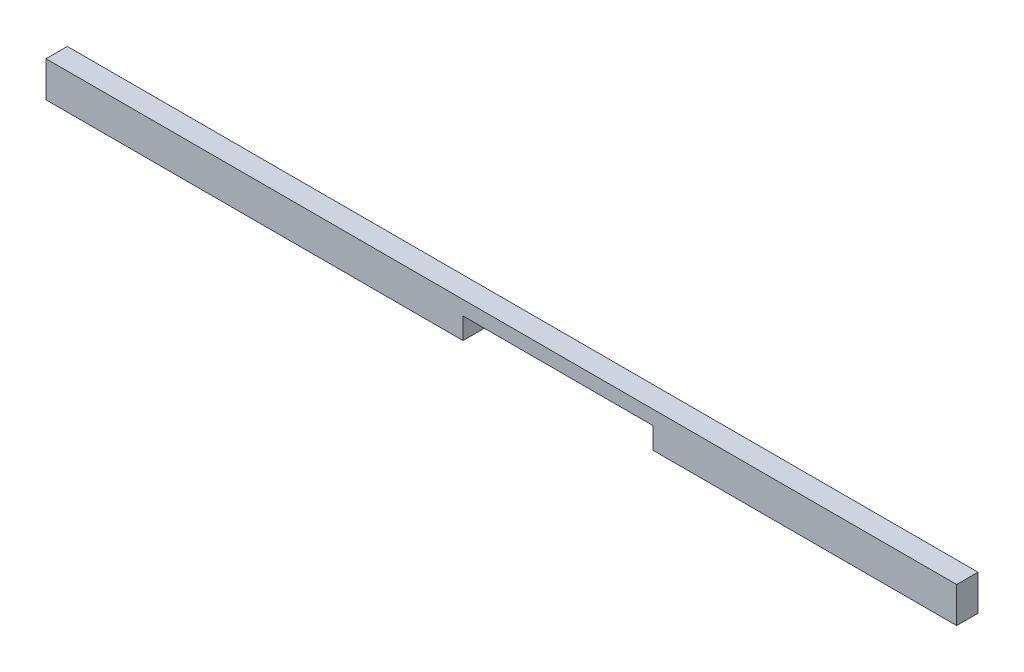
ISO-10303-21;
HEADER;
FILE_DESCRIPTION(('STEP AP214'),'2;1');
FILE_NAME('part.step','',(''),(''),'','','');
FILE_SCHEMA(('AUTOMOTIVE_DESIGN { 1 0 10303 214 1 1 1 1 }'));
ENDSEC;
DATA;
#1=APPLICATION_CONTEXT('core data for automotive mechanical design processes');
#2=APPLICATION_PROTOCOL_DEFINITION('international standard','automotive_design',2000,#1);
#3=PRODUCT_CONTEXT('',#1,'mechanical');
#4=PRODUCT('Part','Part','',(#3));
#5=PRODUCT_RELATED_PRODUCT_CATEGORY('part','',(#4));
#6=PRODUCT_DEFINITION_FORMATION('','',#4);
#7=PRODUCT_DEFINITION_CONTEXT('part definition',#1,'design');
#8=PRODUCT_DEFINITION('design','',#6,#7);
#9=PRODUCT_DEFINITION_SHAPE('','',#8);
#10=(LENGTH_UNIT() NAMED_UNIT(*) SI_UNIT(.MILLI.,.METRE.));
#11=(NAMED_UNIT(*) PLANE_ANGLE_UNIT() SI_UNIT($,.RADIAN.));
#12=(NAMED_UNIT(*) SI_UNIT($,.STERADIAN.) SOLID_ANGLE_UNIT());
#13=UNCERTAINTY_MEASURE_WITH_UNIT(LENGTH_MEASURE(1.E-05),#10,'distance_accuracy_value','');
#14=(GEOMETRIC_REPRESENTATION_CONTEXT(3) GLOBAL_UNCERTAINTY_ASSIGNED_CONTEXT((#13)) GLOBAL_UNIT_ASSIGNED_CONTEXT((#10,
#11,#12)) REPRESENTATION_CONTEXT('',''));
#15=CARTESIAN_POINT('',(0.,0.,0.));
#16=DIRECTION('',(0.,0.,1.));
#17=DIRECTION('',(1.,0.,0.));
#18=AXIS2_PLACEMENT_3D('',#15,#16,#17);
#19=CARTESIAN_POINT('',(0.,0.,0.));
#20=DIRECTION('',(0.,-1.,0.));
#21=DIRECTION('',(0.,0.,-1.));
#22=AXIS2_PLACEMENT_3D('',#19,#20,#21);
#23=PLANE('',#22);
#24=DIRECTION('',(0.,0.,-1.));
#25=VECTOR('',#24,1.);
#26=CARTESIAN_POINT('',(-34.1824934363978,0.,9.525));
#27=LINE('',#26,#25);
#28=CARTESIAN_POINT('',(-34.1824934363978,0.,9.525));
#29=VERTEX_POINT('',#28);
#30=CARTESIAN_POINT('',(-34.1824934363978,0.,-9.525));
#31=VERTEX_POINT('',#30);
#32=EDGE_CURVE('E139',#29,#31,#27,.T.);
#33=ORIENTED_EDGE('',*,*,#32,.F.);
#34=DIRECTION('',(1.,0.,0.));
#35=VECTOR('',#34,1.);
#36=CARTESIAN_POINT('',(-406.4,0.,9.525));
#37=LINE('',#36,#35);
#38=CARTESIAN_POINT('',(-406.4,0.,9.525));
#39=VERTEX_POINT('',#38);
#40=EDGE_CURVE('E131',#39,#29,#37,.T.);
#41=ORIENTED_EDGE('',*,*,#40,.F.);
#42=DIRECTION('',(0.,0.,1.));
#43=VECTOR('',#42,1.);
#44=CARTESIAN_POINT('',(-406.4,0.,9.525));
#45=LINE('',#44,#43);
#46=CARTESIAN_POINT('',(-406.4,0.,-9.525));
#47=VERTEX_POINT('',#46);
#48=EDGE_CURVE('E158',#47,#39,#45,.T.);
#49=ORIENTED_EDGE('',*,*,#48,.F.);
#50=DIRECTION('',(-1.,0.,0.));
#51=VECTOR('',#50,1.);
#52=CARTESIAN_POINT('',(-406.4,0.,-9.525));
#53=LINE('',#52,#51);
#54=EDGE_CURVE('E154',#31,#47,#53,.T.);
#55=ORIENTED_EDGE('',*,*,#54,.F.);
#56=EDGE_LOOP('',(#33,#41,#49,#55));
#57=FACE_BOUND('',#56,.T.);
#58=ADVANCED_FACE('F35',(#57),#23,.T.);
#59=CARTESIAN_POINT('',(406.4,31.75,9.525));
#60=DIRECTION('',(-1.,0.,0.));
#61=DIRECTION('',(0.,0.,1.));
#62=AXIS2_PLACEMENT_3D('',#59,#60,#61);
#63=PLANE('',#62);
#64=DIRECTION('',(0.,0.,-1.));
#65=VECTOR('',#64,1.);
#66=CARTESIAN_POINT('',(406.4,0.,9.525));
#67=LINE('',#66,#65);
#68=CARTESIAN_POINT('',(406.4,0.,9.525));
#69=VERTEX_POINT('',#68);
#70=CARTESIAN_POINT('',(406.4,0.,-9.525));
#71=VERTEX_POINT('',#70);
#72=EDGE_CURVE('E141',#69,#71,#67,.T.);
#73=ORIENTED_EDGE('',*,*,#72,.T.);
#74=DIRECTION('',(0.,-1.,0.));
#75=VECTOR('',#74,1.);
#76=CARTESIAN_POINT('',(406.4,31.75,-9.525));
#77=LINE('',#76,#75);
#78=CARTESIAN_POINT('',(406.4,31.75,-9.525));
#79=VERTEX_POINT('',#78);
#80=EDGE_CURVE('E11',#79,#71,#77,.T.);
#81=ORIENTED_EDGE('',*,*,#80,.F.);
#82=DIRECTION('',(0.,0.,-1.));
#83=VECTOR('',#82,1.);
#84=CARTESIAN_POINT('',(406.4,31.75,9.525));
#85=LINE('',#84,#83);
#86=CARTESIAN_POINT('',(406.4,31.75,9.525));
#87=VERTEX_POINT('',#86);
#88=EDGE_CURVE('E145',#87,#79,#85,.T.);
#89=ORIENTED_EDGE('',*,*,#88,.F.);
#90=DIRECTION('',(0.,-1.,0.));
#91=VECTOR('',#90,1.);
#92=CARTESIAN_POINT('',(406.4,31.75,9.525));
#93=LINE('',#92,#91);
#94=EDGE_CURVE('E151',#87,#69,#93,.T.);
#95=ORIENTED_EDGE('',*,*,#94,.T.);
#96=EDGE_LOOP('',(#73,#81,#89,#95));
#97=FACE_BOUND('',#96,.T.);
#98=ADVANCED_FACE('F37',(#97),#63,.F.);
#99=CARTESIAN_POINT('',(-406.4,31.75,-9.525));
#100=DIRECTION('',(0.,0.,1.));
#101=DIRECTION('',(1.,0.,0.));
#102=AXIS2_PLACEMENT_3D('',#99,#100,#101);
#103=PLANE('',#102);
#104=DIRECTION('',(1.,0.,0.));
#105=VECTOR('',#104,1.);
#106=CARTESIAN_POINT('',(-34.1824934363978,19.05,-9.525));
#107=LINE('',#106,#105);
#108=CARTESIAN_POINT('',(-34.1824934363978,19.05,-9.525));
#109=VERTEX_POINT('',#108);
#110=CARTESIAN_POINT('',(135.206139415608,19.05,-9.525));
#111=VERTEX_POINT('',#110);
#112=EDGE_CURVE('E133',#109,#111,#107,.T.);
#113=ORIENTED_EDGE('',*,*,#112,.F.);
#114=DIRECTION('',(0.,1.,0.));
#115=VECTOR('',#114,1.);
#116=CARTESIAN_POINT('',(-34.1824934363978,0.,-9.525));
#117=LINE('',#116,#115);
#118=EDGE_CURVE('E115',#31,#109,#117,.T.);
#119=ORIENTED_EDGE('',*,*,#118,.F.);
#120=ORIENTED_EDGE('',*,*,#54,.T.);
#121=DIRECTION('',(0.,-1.,0.));
#122=VECTOR('',#121,1.);
#123=CARTESIAN_POINT('',(-406.4,31.75,-9.525));
#124=LINE('',#123,#122);
#125=CARTESIAN_POINT('',(-406.4,31.75,-9.525));
#126=VERTEX_POINT('',#125);
#127=EDGE_CURVE('E43',#126,#47,#124,.T.);
#128=ORIENTED_EDGE('',*,*,#127,.F.);
#129=DIRECTION('',(-1.,0.,0.));
#130=VECTOR('',#129,1.);
#131=CARTESIAN_POINT('',(-406.4,31.75,-9.525));
#132=LINE('',#131,#130);
#133=EDGE_CURVE('E87',#79,#126,#132,.T.);
#134=ORIENTED_EDGE('',*,*,#133,.F.);
#135=ORIENTED_EDGE('',*,*,#80,.T.);
#136=CARTESIAN_POINT('',(135.206139415608,0.,-9.525));
#137=VERTEX_POINT('',#136);
#138=EDGE_CURVE('E155',#71,#137,#53,.T.);
#139=ORIENTED_EDGE('',*,*,#138,.T.);
#140=DIRECTION('',(0.,-1.,0.));
#141=VECTOR('',#140,1.);
#142=CARTESIAN_POINT('',(135.206139415608,19.05,-9.525));
#143=LINE('',#142,#141);
#144=EDGE_CURVE('E50',#111,#137,#143,.T.);
#145=ORIENTED_EDGE('',*,*,#144,.F.);
#146=EDGE_LOOP('',(#113,#119,#120,#128,#134,#135,#139,#145));
#147=FACE_BOUND('',#146,.T.);
#148=ADVANCED_FACE('F171',(#147),#103,.F.);
#149=CARTESIAN_POINT('',(-406.4,31.75,9.525));
#150=DIRECTION('',(1.,0.,0.));
#151=DIRECTION('',(0.,0.,-1.));
#152=AXIS2_PLACEMENT_3D('',#149,#150,#151);
#153=PLANE('',#152);
#154=ORIENTED_EDGE('',*,*,#48,.T.);
#155=DIRECTION('',(0.,-1.,0.));
#156=VECTOR('',#155,1.);
#157=CARTESIAN_POINT('',(-406.4,31.75,9.525));
#158=LINE('',#157,#156);
#159=CARTESIAN_POINT('',(-406.4,31.75,9.525));
#160=VERTEX_POINT('',#159);
#161=EDGE_CURVE('E162',#160,#39,#158,.T.);
#162=ORIENTED_EDGE('',*,*,#161,.F.);
#163=DIRECTION('',(0.,0.,1.));
#164=VECTOR('',#163,1.);
#165=CARTESIAN_POINT('',(-406.4,31.75,9.525));
#166=LINE('',#165,#164);
#167=EDGE_CURVE('E148',#126,#160,#166,.T.);
#168=ORIENTED_EDGE('',*,*,#167,.F.);
#169=ORIENTED_EDGE('',*,*,#127,.T.);
#170=EDGE_LOOP('',(#154,#162,#168,#169));
#171=FACE_BOUND('',#170,.T.);
#172=ADVANCED_FACE('F167',(#171),#153,.F.);
#173=CARTESIAN_POINT('',(-406.4,31.75,9.525));
#174=DIRECTION('',(0.,0.,-1.));
#175=DIRECTION('',(-1.,0.,0.));
#176=AXIS2_PLACEMENT_3D('',#173,#174,#175);
#177=PLANE('',#176);
#178=ORIENTED_EDGE('',*,*,#40,.T.);
#179=DIRECTION('',(0.,1.,0.));
#180=VECTOR('',#179,1.);
#181=CARTESIAN_POINT('',(-34.1824934363978,0.,9.525));
#182=LINE('',#181,#180);
#183=CARTESIAN_POINT('',(-34.1824934363978,19.05,9.525));
#184=VERTEX_POINT('',#183);
#185=EDGE_CURVE('E112',#29,#184,#182,.T.);
#186=ORIENTED_EDGE('',*,*,#185,.T.);
#187=DIRECTION('',(1.,0.,0.));
#188=VECTOR('',#187,1.);
#189=CARTESIAN_POINT('',(-34.1824934363978,19.05,9.525));
#190=LINE('',#189,#188);
#191=CARTESIAN_POINT('',(135.206139415608,19.05,9.525));
#192=VERTEX_POINT('',#191);
#193=EDGE_CURVE('E123',#184,#192,#190,.T.);
#194=ORIENTED_EDGE('',*,*,#193,.T.);
#195=DIRECTION('',(0.,-1.,0.));
#196=VECTOR('',#195,1.);
#197=CARTESIAN_POINT('',(135.206139415608,19.05,9.525));
#198=LINE('',#197,#196);
#199=CARTESIAN_POINT('',(135.206139415608,0.,9.525));
#200=VERTEX_POINT('',#199);
#201=EDGE_CURVE('E120',#192,#200,#198,.T.);
#202=ORIENTED_EDGE('',*,*,#201,.T.);
#203=EDGE_CURVE('E80',#200,#69,#37,.T.);
#204=ORIENTED_EDGE('',*,*,#203,.T.);
#205=ORIENTED_EDGE('',*,*,#94,.F.);
#206=DIRECTION('',(1.,0.,0.));
#207=VECTOR('',#206,1.);
#208=CARTESIAN_POINT('',(-406.4,31.75,9.525));
#209=LINE('',#208,#207);
#210=EDGE_CURVE('E59',#160,#87,#209,.T.);
#211=ORIENTED_EDGE('',*,*,#210,.F.);
#212=ORIENTED_EDGE('',*,*,#161,.T.);
#213=EDGE_LOOP('',(#178,#186,#194,#202,#204,#205,#211,#212));
#214=FACE_BOUND('',#213,.T.);
#215=ADVANCED_FACE('F128',(#214),#177,.F.);
#216=CARTESIAN_POINT('',(0.,31.75,0.));
#217=DIRECTION('',(0.,-1.,0.));
#218=DIRECTION('',(0.,0.,-1.));
#219=AXIS2_PLACEMENT_3D('',#216,#217,#218);
#220=PLANE('',#219);
#221=ORIENTED_EDGE('',*,*,#88,.T.);
#222=ORIENTED_EDGE('',*,*,#133,.T.);
#223=ORIENTED_EDGE('',*,*,#167,.T.);
#224=ORIENTED_EDGE('',*,*,#210,.T.);
#225=EDGE_LOOP('',(#221,#222,#223,#224));
#226=FACE_BOUND('',#225,.T.);
#227=ADVANCED_FACE('F194',(#226),#220,.F.);
#228=DIRECTION('',(0.,0.,-1.));
#229=VECTOR('',#228,1.);
#230=CARTESIAN_POINT('',(135.206139415608,0.,9.525));
#231=LINE('',#230,#229);
#232=EDGE_CURVE('E142',#200,#137,#231,.T.);
#233=ORIENTED_EDGE('',*,*,#232,.T.);
#234=ORIENTED_EDGE('',*,*,#138,.F.);
#235=ORIENTED_EDGE('',*,*,#72,.F.);
#236=ORIENTED_EDGE('',*,*,#203,.F.);
#237=EDGE_LOOP('',(#233,#234,#235,#236));
#238=FACE_BOUND('',#237,.T.);
#239=ADVANCED_FACE('F175',(#238),#23,.T.);
#240=CARTESIAN_POINT('',(-34.1824934363978,0.,9.525));
#241=DIRECTION('',(-1.,0.,0.));
#242=DIRECTION('',(0.,0.,1.));
#243=AXIS2_PLACEMENT_3D('',#240,#241,#242);
#244=PLANE('',#243);
#245=ORIENTED_EDGE('',*,*,#118,.T.);
#246=DIRECTION('',(0.,0.,-1.));
#247=VECTOR('',#246,1.);
#248=CARTESIAN_POINT('',(-34.1824934363978,19.05,9.525));
#249=LINE('',#248,#247);
#250=EDGE_CURVE('E108',#184,#109,#249,.T.);
#251=ORIENTED_EDGE('',*,*,#250,.F.);
#252=ORIENTED_EDGE('',*,*,#185,.F.);
#253=ORIENTED_EDGE('',*,*,#32,.T.);
#254=EDGE_LOOP('',(#245,#251,#252,#253));
#255=FACE_BOUND('',#254,.T.);
#256=ADVANCED_FACE('F110',(#255),#244,.F.);
#257=CARTESIAN_POINT('',(135.206139415608,19.05,9.525));
#258=DIRECTION('',(1.,0.,0.));
#259=DIRECTION('',(0.,0.,-1.));
#260=AXIS2_PLACEMENT_3D('',#257,#258,#259);
#261=PLANE('',#260);
#262=ORIENTED_EDGE('',*,*,#144,.T.);
#263=ORIENTED_EDGE('',*,*,#232,.F.);
#264=ORIENTED_EDGE('',*,*,#201,.F.);
#265=DIRECTION('',(0.,0.,-1.));
#266=VECTOR('',#265,1.);
#267=CARTESIAN_POINT('',(135.206139415608,19.05,9.525));
#268=LINE('',#267,#266);
#269=EDGE_CURVE('E119',#192,#111,#268,.T.);
#270=ORIENTED_EDGE('',*,*,#269,.T.);
#271=EDGE_LOOP('',(#262,#263,#264,#270));
#272=FACE_BOUND('',#271,.T.);
#273=ADVANCED_FACE('F176',(#272),#261,.F.);
#274=CARTESIAN_POINT('',(-34.1824934363978,19.05,9.525));
#275=DIRECTION('',(0.,1.,0.));
#276=DIRECTION('',(0.,0.,1.));
#277=AXIS2_PLACEMENT_3D('',#274,#275,#276);
#278=PLANE('',#277);
#279=ORIENTED_EDGE('',*,*,#112,.T.);
#280=ORIENTED_EDGE('',*,*,#269,.F.);
#281=ORIENTED_EDGE('',*,*,#193,.F.);
#282=ORIENTED_EDGE('',*,*,#250,.T.);
#283=EDGE_LOOP('',(#279,#280,#281,#282));
#284=FACE_BOUND('',#283,.T.);
#285=ADVANCED_FACE('F124',(#284),#278,.F.);
#286=CLOSED_SHELL('',(#58,#98,#148,#172,#215,#227,#239,#256,#273,#285));
#287=MANIFOLD_SOLID_BREP('B2',#286);
#288=ADVANCED_BREP_SHAPE_REPRESENTATION('',(#18,#287),#14);
#289=SHAPE_DEFINITION_REPRESENTATION(#9,#288);
ENDSEC;
END-ISO-10303-21;
